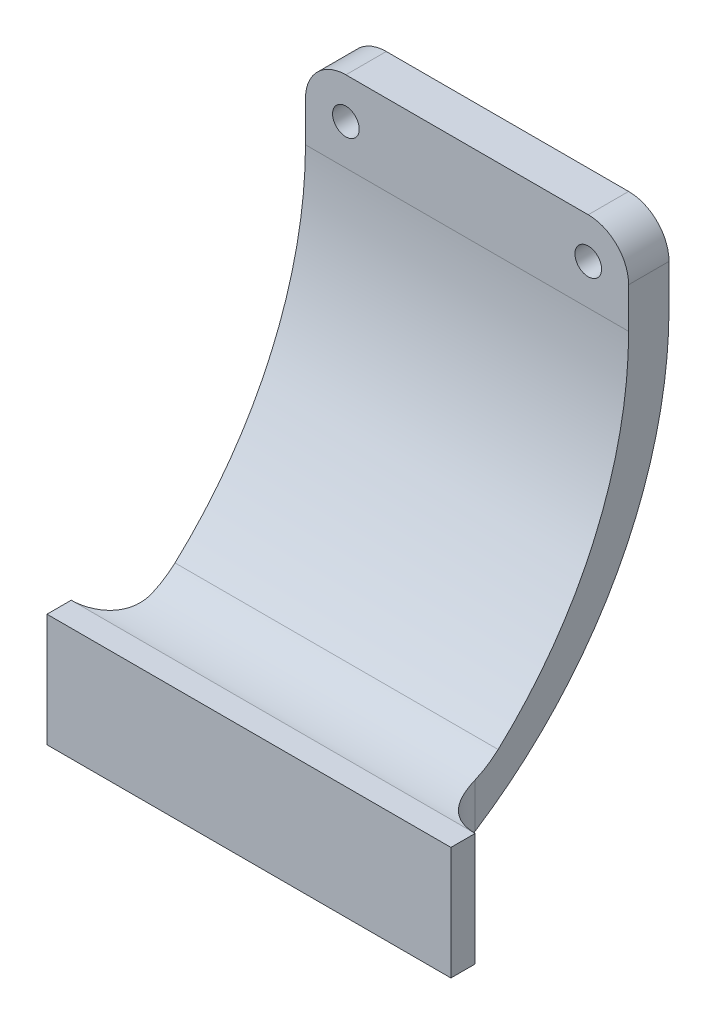
ISO-10303-21;
HEADER;
FILE_DESCRIPTION(('STEP AP214'),'2;1');
FILE_NAME('part.step','',(''),(''),'','','');
FILE_SCHEMA(('AUTOMOTIVE_DESIGN { 1 0 10303 214 1 1 1 1 }'));
ENDSEC;
DATA;
#1=APPLICATION_CONTEXT('core data for automotive mechanical design processes');
#2=APPLICATION_PROTOCOL_DEFINITION('international standard','automotive_design',2000,#1);
#3=PRODUCT_CONTEXT('',#1,'mechanical');
#4=PRODUCT('Part','Part','',(#3));
#5=PRODUCT_RELATED_PRODUCT_CATEGORY('part','',(#4));
#6=PRODUCT_DEFINITION_FORMATION('','',#4);
#7=PRODUCT_DEFINITION_CONTEXT('part definition',#1,'design');
#8=PRODUCT_DEFINITION('design','',#6,#7);
#9=PRODUCT_DEFINITION_SHAPE('','',#8);
#10=(LENGTH_UNIT() NAMED_UNIT(*) SI_UNIT(.MILLI.,.METRE.));
#11=(NAMED_UNIT(*) PLANE_ANGLE_UNIT() SI_UNIT($,.RADIAN.));
#12=(NAMED_UNIT(*) SI_UNIT($,.STERADIAN.) SOLID_ANGLE_UNIT());
#13=UNCERTAINTY_MEASURE_WITH_UNIT(LENGTH_MEASURE(1.E-05),#10,'distance_accuracy_value','');
#14=(GEOMETRIC_REPRESENTATION_CONTEXT(3) GLOBAL_UNCERTAINTY_ASSIGNED_CONTEXT((#13)) GLOBAL_UNIT_ASSIGNED_CONTEXT((#10,
#11,#12)) REPRESENTATION_CONTEXT('',''));
#15=CARTESIAN_POINT('',(0.,0.,0.));
#16=DIRECTION('',(0.,0.,1.));
#17=DIRECTION('',(1.,0.,0.));
#18=AXIS2_PLACEMENT_3D('',#15,#16,#17);
#19=CARTESIAN_POINT('',(-5.,5.,-5.));
#20=DIRECTION('',(1.,0.,0.));
#21=DIRECTION('',(0.,0.,1.));
#22=AXIS2_PLACEMENT_3D('',#19,#20,#21);
#23=PLANE('',#22);
#24=DIRECTION('',(0.,-1.,0.));
#25=VECTOR('',#24,1.);
#26=CARTESIAN_POINT('',(-5.,5.,-5.));
#27=LINE('',#26,#25);
#28=CARTESIAN_POINT('',(-5.,0.,-5.));
#29=VERTEX_POINT('',#28);
#30=CARTESIAN_POINT('',(-5.,-5.,-5.));
#31=VERTEX_POINT('',#30);
#32=EDGE_CURVE('E232',#29,#31,#27,.T.);
#33=ORIENTED_EDGE('',*,*,#32,.T.);
#34=CARTESIAN_POINT('',(-5.,-5.,47.4812709593483));
#35=DIRECTION('',(-1.,0.,0.));
#36=DIRECTION('',(0.,0.,1.));
#37=AXIS2_PLACEMENT_3D('',#34,#35,#36);
#38=CIRCLE('',#37,52.4812709593483);
#39=CARTESIAN_POINT('',(-5.,-49.0806193927526,19.));
#40=VERTEX_POINT('',#39);
#41=EDGE_CURVE('E211',#40,#31,#38,.F.);
#42=ORIENTED_EDGE('',*,*,#41,.F.);
#43=DIRECTION('',(0.,1.,0.));
#44=VECTOR('',#43,1.);
#45=CARTESIAN_POINT('',(-5.,-57.753328953178,19.));
#46=LINE('',#45,#44);
#47=CARTESIAN_POINT('',(-5.,-43.5810930202883,19.));
#48=VERTEX_POINT('',#47);
#49=EDGE_CURVE('E282',#48,#40,#46,.F.);
#50=ORIENTED_EDGE('',*,*,#49,.F.);
#51=CARTESIAN_POINT('',(-5.,-34.3789185712698,22.9140752943487));
#52=DIRECTION('',(-1.,0.,0.));
#53=DIRECTION('',(0.,0.,1.));
#54=AXIS2_PLACEMENT_3D('',#51,#52,#53);
#55=CIRCLE('',#54,10.);
#56=CARTESIAN_POINT('',(-5.,-41.7466961071543,16.1527252677848));
#57=VERTEX_POINT('',#56);
#58=EDGE_CURVE('E165',#57,#48,#55,.T.);
#59=ORIENTED_EDGE('',*,*,#58,.F.);
#60=CARTESIAN_POINT('',(-5.,-5.,49.8748719382214));
#61=DIRECTION('',(-1.,0.,0.));
#62=DIRECTION('',(0.,0.,1.));
#63=AXIS2_PLACEMENT_3D('',#60,#61,#62);
#64=CIRCLE('',#63,49.8748719382214);
#65=CARTESIAN_POINT('',(-5.,-5.,0.));
#66=VERTEX_POINT('',#65);
#67=EDGE_CURVE('E208',#66,#57,#64,.T.);
#68=ORIENTED_EDGE('',*,*,#67,.F.);
#69=DIRECTION('',(0.,-1.,0.));
#70=VECTOR('',#69,1.);
#71=CARTESIAN_POINT('',(-5.,5.,0.));
#72=LINE('',#71,#70);
#73=CARTESIAN_POINT('',(-5.,0.,0.));
#74=VERTEX_POINT('',#73);
#75=EDGE_CURVE('E229',#74,#66,#72,.T.);
#76=ORIENTED_EDGE('',*,*,#75,.F.);
#77=DIRECTION('',(0.,0.,1.));
#78=VECTOR('',#77,1.);
#79=CARTESIAN_POINT('',(-5.,0.,-5.));
#80=LINE('',#79,#78);
#81=EDGE_CURVE('E284',#29,#74,#80,.T.);
#82=ORIENTED_EDGE('',*,*,#81,.F.);
#83=EDGE_LOOP('',(#33,#42,#50,#59,#68,#76,#82));
#84=FACE_BOUND('',#83,.T.);
#85=ADVANCED_FACE('F43',(#84),#23,.F.);
#86=CARTESIAN_POINT('',(35.,5.,-5.));
#87=DIRECTION('',(-1.,0.,0.));
#88=DIRECTION('',(0.,0.,-1.));
#89=AXIS2_PLACEMENT_3D('',#86,#87,#88);
#90=PLANE('',#89);
#91=DIRECTION('',(0.,1.,0.));
#92=VECTOR('',#91,1.);
#93=CARTESIAN_POINT('',(35.,5.,0.));
#94=LINE('',#93,#92);
#95=CARTESIAN_POINT('',(35.,-5.,0.));
#96=VERTEX_POINT('',#95);
#97=CARTESIAN_POINT('',(35.,0.,0.));
#98=VERTEX_POINT('',#97);
#99=EDGE_CURVE('E249',#96,#98,#94,.T.);
#100=ORIENTED_EDGE('',*,*,#99,.F.);
#101=CARTESIAN_POINT('',(35.,-5.,49.8748719382214));
#102=DIRECTION('',(1.,0.,0.));
#103=DIRECTION('',(0.,0.,1.));
#104=AXIS2_PLACEMENT_3D('',#101,#102,#103);
#105=CIRCLE('',#104,49.8748719382214);
#106=CARTESIAN_POINT('',(35.,-41.7466961071543,16.1527252677848));
#107=VERTEX_POINT('',#106);
#108=EDGE_CURVE('E212',#107,#96,#105,.T.);
#109=ORIENTED_EDGE('',*,*,#108,.F.);
#110=CARTESIAN_POINT('',(35.,-34.3789185712698,22.9140752943487));
#111=DIRECTION('',(1.,0.,0.));
#112=DIRECTION('',(0.,0.,-1.));
#113=AXIS2_PLACEMENT_3D('',#110,#111,#112);
#114=CIRCLE('',#113,10.);
#115=CARTESIAN_POINT('',(35.,-43.5810930202883,19.));
#116=VERTEX_POINT('',#115);
#117=EDGE_CURVE('E260',#116,#107,#114,.T.);
#118=ORIENTED_EDGE('',*,*,#117,.F.);
#119=DIRECTION('',(0.,-1.,0.));
#120=VECTOR('',#119,1.);
#121=CARTESIAN_POINT('',(35.,-44.3197820917923,19.));
#122=LINE('',#121,#120);
#123=CARTESIAN_POINT('',(35.,-49.0806193927526,19.));
#124=VERTEX_POINT('',#123);
#125=EDGE_CURVE('E271',#124,#116,#122,.F.);
#126=ORIENTED_EDGE('',*,*,#125,.F.);
#127=CARTESIAN_POINT('',(35.,-5.,47.4812709593483));
#128=DIRECTION('',(-1.,0.,0.));
#129=DIRECTION('',(0.,0.,1.));
#130=AXIS2_PLACEMENT_3D('',#127,#128,#129);
#131=CIRCLE('',#130,52.4812709593483);
#132=CARTESIAN_POINT('',(35.,-5.,-5.));
#133=VERTEX_POINT('',#132);
#134=EDGE_CURVE('E205',#133,#124,#131,.T.);
#135=ORIENTED_EDGE('',*,*,#134,.F.);
#136=DIRECTION('',(0.,1.,0.));
#137=VECTOR('',#136,1.);
#138=CARTESIAN_POINT('',(35.,5.,-5.));
#139=LINE('',#138,#137);
#140=CARTESIAN_POINT('',(35.,0.,-5.));
#141=VERTEX_POINT('',#140);
#142=EDGE_CURVE('E238',#133,#141,#139,.T.);
#143=ORIENTED_EDGE('',*,*,#142,.T.);
#144=DIRECTION('',(0.,0.,1.));
#145=VECTOR('',#144,1.);
#146=CARTESIAN_POINT('',(35.,0.,-5.));
#147=LINE('',#146,#145);
#148=EDGE_CURVE('E274',#98,#141,#147,.F.);
#149=ORIENTED_EDGE('',*,*,#148,.F.);
#150=EDGE_LOOP('',(#100,#109,#118,#126,#135,#143,#149));
#151=FACE_BOUND('',#150,.T.);
#152=ADVANCED_FACE('F327',(#151),#90,.F.);
#153=CARTESIAN_POINT('',(-62.9551666497327,-5.,47.4812709593483));
#154=DIRECTION('',(1.,0.,0.));
#155=DIRECTION('',(0.,0.,1.));
#156=AXIS2_PLACEMENT_3D('',#153,#154,#155);
#157=CYLINDRICAL_SURFACE('',#156,52.4812709593483);
#158=ORIENTED_EDGE('',*,*,#41,.T.);
#159=DIRECTION('',(1.,0.,0.));
#160=VECTOR('',#159,1.);
#161=CARTESIAN_POINT('',(-5.,-5.,-5.));
#162=LINE('',#161,#160);
#163=EDGE_CURVE('E235',#31,#133,#162,.T.);
#164=ORIENTED_EDGE('',*,*,#163,.T.);
#165=ORIENTED_EDGE('',*,*,#134,.T.);
#166=CARTESIAN_POINT('',(35.0128766322397,-49.310266233231,19.3586091392302));
#167=CARTESIAN_POINT('',(35.0085787431682,-49.2722693323532,19.2987404613218));
#168=CARTESIAN_POINT('',(35.0053567459458,-49.2341336452079,19.2389220274318));
#169=CARTESIAN_POINT('',(35.0010645351992,-49.1575846983818,19.1193856476884));
#170=CARTESIAN_POINT('',(34.9999943216751,-49.119171438701,19.059667701835));
#171=CARTESIAN_POINT('',(35.,-49.0806193927526,19.));
#172=B_SPLINE_CURVE_WITH_KNOTS('',3,(#166,#167,#168,#169,#170,#171),.UNSPECIFIED.,.F.,.F.,(4,2,
4),(0.,0.213041339647605,0.426082679295853),.UNSPECIFIED.);
#173=CARTESIAN_POINT('',(35.0128766322397,-49.310266233231,19.3586091392302));
#174=VERTEX_POINT('',#173);
#175=EDGE_CURVE('E293',#174,#124,#172,.T.);
#176=ORIENTED_EDGE('',*,*,#175,.F.);
#177=DIRECTION('',(1.,0.,0.));
#178=VECTOR('',#177,1.);
#179=CARTESIAN_POINT('',(-62.9551666497327,-49.310266233231,19.3586091392302));
#180=LINE('',#179,#178);
#181=CARTESIAN_POINT('',(-5.01287663223972,-49.310266233231,19.3586091392302));
#182=VERTEX_POINT('',#181);
#183=EDGE_CURVE('E257',#182,#174,#180,.T.);
#184=ORIENTED_EDGE('',*,*,#183,.F.);
#185=CARTESIAN_POINT('',(-5.,-49.0806193927526,19.));
#186=CARTESIAN_POINT('',(-4.99999432167506,-49.119171438701,19.059667701835));
#187=CARTESIAN_POINT('',(-5.00106453519925,-49.1575846983817,19.1193856476884));
#188=CARTESIAN_POINT('',(-5.00535674594583,-49.2341336452079,19.2389220274318));
#189=CARTESIAN_POINT('',(-5.00857874316822,-49.2722693323532,19.2987404613218));
#190=CARTESIAN_POINT('',(-5.01287663223973,-49.310266233231,19.3586091392302));
#191=B_SPLINE_CURVE_WITH_KNOTS('',3,(#185,#186,#187,#188,#189,#190),.UNSPECIFIED.,.F.,.F.,(4,2,
4),(0.,0.213041339648248,0.426082679295861),.UNSPECIFIED.);
#192=EDGE_CURVE('E58',#40,#182,#191,.T.);
#193=ORIENTED_EDGE('',*,*,#192,.F.);
#194=EDGE_LOOP('',(#158,#164,#165,#176,#184,#193));
#195=FACE_BOUND('',#194,.T.);
#196=ADVANCED_FACE('F331',(#195),#157,.T.);
#197=CARTESIAN_POINT('',(-62.9551666497327,-5.,49.8748719382214));
#198=DIRECTION('',(1.,0.,0.));
#199=DIRECTION('',(0.,0.,1.));
#200=AXIS2_PLACEMENT_3D('',#197,#198,#199);
#201=CYLINDRICAL_SURFACE('',#200,49.8748719382214);
#202=ORIENTED_EDGE('',*,*,#108,.T.);
#203=DIRECTION('',(1.,0.,0.));
#204=VECTOR('',#203,1.);
#205=CARTESIAN_POINT('',(-5.,-5.,0.));
#206=LINE('',#205,#204);
#207=EDGE_CURVE('E247',#66,#96,#206,.T.);
#208=ORIENTED_EDGE('',*,*,#207,.F.);
#209=ORIENTED_EDGE('',*,*,#67,.T.);
#210=DIRECTION('',(1.,0.,0.));
#211=VECTOR('',#210,1.);
#212=CARTESIAN_POINT('',(-62.9551666497327,-41.7466961071543,16.1527252677848));
#213=LINE('',#212,#211);
#214=EDGE_CURVE('E244',#107,#57,#213,.F.);
#215=ORIENTED_EDGE('',*,*,#214,.F.);
#216=EDGE_LOOP('',(#202,#208,#209,#215));
#217=FACE_BOUND('',#216,.T.);
#218=ADVANCED_FACE('F345',(#217),#201,.F.);
#219=CARTESIAN_POINT('',(0.,0.,-5.));
#220=DIRECTION('',(0.,0.,-1.));
#221=DIRECTION('',(1.,0.,0.));
#222=AXIS2_PLACEMENT_3D('',#219,#220,#221);
#223=PLANE('',#222);
#224=CARTESIAN_POINT('',(0.,0.,-5.));
#225=DIRECTION('',(0.,0.,1.));
#226=DIRECTION('',(1.,0.,0.));
#227=AXIS2_PLACEMENT_3D('',#224,#225,#226);
#228=CIRCLE('',#227,1.65);
#229=CARTESIAN_POINT('',(1.65,0.,-5.));
#230=VERTEX_POINT('',#229);
#231=EDGE_CURVE('E226',#230,#230,#228,.T.);
#232=ORIENTED_EDGE('',*,*,#231,.T.);
#233=EDGE_LOOP('',(#232));
#234=FACE_BOUND('',#233,.T.);
#235=ORIENTED_EDGE('',*,*,#142,.F.);
#236=ORIENTED_EDGE('',*,*,#163,.F.);
#237=ORIENTED_EDGE('',*,*,#32,.F.);
#238=CARTESIAN_POINT('',(0.,0.,-5.));
#239=DIRECTION('',(0.,0.,1.));
#240=DIRECTION('',(1.,0.,0.));
#241=AXIS2_PLACEMENT_3D('',#238,#239,#240);
#242=CIRCLE('',#241,5.);
#243=CARTESIAN_POINT('',(0.,5.,-5.));
#244=VERTEX_POINT('',#243);
#245=EDGE_CURVE('E277',#244,#29,#242,.T.);
#246=ORIENTED_EDGE('',*,*,#245,.F.);
#247=DIRECTION('',(-1.,0.,0.));
#248=VECTOR('',#247,1.);
#249=CARTESIAN_POINT('',(-5.,5.,-5.));
#250=LINE('',#249,#248);
#251=CARTESIAN_POINT('',(30.,5.,-5.));
#252=VERTEX_POINT('',#251);
#253=EDGE_CURVE('E241',#252,#244,#250,.T.);
#254=ORIENTED_EDGE('',*,*,#253,.F.);
#255=CARTESIAN_POINT('',(30.,0.,-5.));
#256=DIRECTION('',(0.,0.,1.));
#257=DIRECTION('',(1.,0.,0.));
#258=AXIS2_PLACEMENT_3D('',#255,#256,#257);
#259=CIRCLE('',#258,5.);
#260=EDGE_CURVE('E279',#141,#252,#259,.T.);
#261=ORIENTED_EDGE('',*,*,#260,.F.);
#262=EDGE_LOOP('',(#235,#236,#237,#246,#254,#261));
#263=FACE_BOUND('',#262,.T.);
#264=CARTESIAN_POINT('',(30.,0.,-5.));
#265=DIRECTION('',(0.,0.,1.));
#266=DIRECTION('',(1.,0.,0.));
#267=AXIS2_PLACEMENT_3D('',#264,#265,#266);
#268=CIRCLE('',#267,1.65);
#269=CARTESIAN_POINT('',(31.65,0.,-5.));
#270=VERTEX_POINT('',#269);
#271=EDGE_CURVE('E220',#270,#270,#268,.T.);
#272=ORIENTED_EDGE('',*,*,#271,.T.);
#273=EDGE_LOOP('',(#272));
#274=FACE_BOUND('',#273,.T.);
#275=ADVANCED_FACE('F341',(#234,#263,#274),#223,.T.);
#276=CARTESIAN_POINT('',(0.,0.,0.));
#277=DIRECTION('',(0.,0.,-1.));
#278=DIRECTION('',(1.,0.,0.));
#279=AXIS2_PLACEMENT_3D('',#276,#277,#278);
#280=PLANE('',#279);
#281=DIRECTION('',(-1.,0.,0.));
#282=VECTOR('',#281,1.);
#283=CARTESIAN_POINT('',(-5.,5.,0.));
#284=LINE('',#283,#282);
#285=CARTESIAN_POINT('',(30.,5.,0.));
#286=VERTEX_POINT('',#285);
#287=CARTESIAN_POINT('',(0.,5.,0.));
#288=VERTEX_POINT('',#287);
#289=EDGE_CURVE('E236',#286,#288,#284,.T.);
#290=ORIENTED_EDGE('',*,*,#289,.T.);
#291=CARTESIAN_POINT('',(0.,0.,0.));
#292=DIRECTION('',(0.,0.,1.));
#293=DIRECTION('',(1.,0.,0.));
#294=AXIS2_PLACEMENT_3D('',#291,#292,#293);
#295=CIRCLE('',#294,5.);
#296=EDGE_CURVE('E266',#74,#288,#295,.F.);
#297=ORIENTED_EDGE('',*,*,#296,.F.);
#298=ORIENTED_EDGE('',*,*,#75,.T.);
#299=ORIENTED_EDGE('',*,*,#207,.T.);
#300=ORIENTED_EDGE('',*,*,#99,.T.);
#301=CARTESIAN_POINT('',(30.,0.,0.));
#302=DIRECTION('',(0.,0.,1.));
#303=DIRECTION('',(1.,0.,0.));
#304=AXIS2_PLACEMENT_3D('',#301,#302,#303);
#305=CIRCLE('',#304,5.);
#306=EDGE_CURVE('E269',#286,#98,#305,.F.);
#307=ORIENTED_EDGE('',*,*,#306,.F.);
#308=EDGE_LOOP('',(#290,#297,#298,#299,#300,#307));
#309=FACE_BOUND('',#308,.T.);
#310=CARTESIAN_POINT('',(0.,0.,0.));
#311=DIRECTION('',(0.,0.,1.));
#312=DIRECTION('',(1.,0.,0.));
#313=AXIS2_PLACEMENT_3D('',#310,#311,#312);
#314=CIRCLE('',#313,1.65);
#315=CARTESIAN_POINT('',(1.65,0.,0.));
#316=VERTEX_POINT('',#315);
#317=EDGE_CURVE('E223',#316,#316,#314,.T.);
#318=ORIENTED_EDGE('',*,*,#317,.F.);
#319=EDGE_LOOP('',(#318));
#320=FACE_BOUND('',#319,.T.);
#321=CARTESIAN_POINT('',(30.,0.,0.));
#322=DIRECTION('',(0.,0.,1.));
#323=DIRECTION('',(1.,0.,0.));
#324=AXIS2_PLACEMENT_3D('',#321,#322,#323);
#325=CIRCLE('',#324,1.65);
#326=CARTESIAN_POINT('',(31.65,0.,0.));
#327=VERTEX_POINT('',#326);
#328=EDGE_CURVE('E215',#327,#327,#325,.T.);
#329=ORIENTED_EDGE('',*,*,#328,.F.);
#330=EDGE_LOOP('',(#329));
#331=FACE_BOUND('',#330,.T.);
#332=ADVANCED_FACE('F337',(#309,#320,#331),#280,.F.);
#333=CARTESIAN_POINT('',(-5.,5.,-5.));
#334=DIRECTION('',(0.,-1.,0.));
#335=DIRECTION('',(0.,0.,1.));
#336=AXIS2_PLACEMENT_3D('',#333,#334,#335);
#337=PLANE('',#336);
#338=ORIENTED_EDGE('',*,*,#253,.T.);
#339=DIRECTION('',(0.,0.,1.));
#340=VECTOR('',#339,1.);
#341=CARTESIAN_POINT('',(0.,5.,-5.));
#342=LINE('',#341,#340);
#343=EDGE_CURVE('E262',#288,#244,#342,.F.);
#344=ORIENTED_EDGE('',*,*,#343,.F.);
#345=ORIENTED_EDGE('',*,*,#289,.F.);
#346=DIRECTION('',(0.,0.,1.));
#347=VECTOR('',#346,1.);
#348=CARTESIAN_POINT('',(30.,5.,-5.));
#349=LINE('',#348,#347);
#350=EDGE_CURVE('E264',#252,#286,#349,.T.);
#351=ORIENTED_EDGE('',*,*,#350,.F.);
#352=EDGE_LOOP('',(#338,#344,#345,#351));
#353=FACE_BOUND('',#352,.T.);
#354=ADVANCED_FACE('F333',(#353),#337,.F.);
#355=CARTESIAN_POINT('',(0.,0.,-5.));
#356=DIRECTION('',(0.,0.,1.));
#357=DIRECTION('',(-1.,0.,0.));
#358=AXIS2_PLACEMENT_3D('',#355,#356,#357);
#359=CYLINDRICAL_SURFACE('',#358,1.65);
#360=ORIENTED_EDGE('',*,*,#231,.F.);
#361=EDGE_LOOP('',(#360));
#362=FACE_BOUND('',#361,.T.);
#363=ORIENTED_EDGE('',*,*,#317,.T.);
#364=EDGE_LOOP('',(#363));
#365=FACE_BOUND('',#364,.T.);
#366=ADVANCED_FACE('F336',(#362,#365),#359,.F.);
#367=CARTESIAN_POINT('',(30.,0.,-5.));
#368=DIRECTION('',(0.,0.,1.));
#369=DIRECTION('',(-1.,0.,0.));
#370=AXIS2_PLACEMENT_3D('',#367,#368,#369);
#371=CYLINDRICAL_SURFACE('',#370,1.65);
#372=ORIENTED_EDGE('',*,*,#271,.F.);
#373=EDGE_LOOP('',(#372));
#374=FACE_BOUND('',#373,.T.);
#375=ORIENTED_EDGE('',*,*,#328,.T.);
#376=EDGE_LOOP('',(#375));
#377=FACE_BOUND('',#376,.T.);
#378=ADVANCED_FACE('F349',(#374,#377),#371,.F.);
#379=CARTESIAN_POINT('',(40.,-58.3197820917923,24.));
#380=DIRECTION('',(0.,-1.,0.));
#381=DIRECTION('',(0.,0.,1.));
#382=AXIS2_PLACEMENT_3D('',#379,#380,#381);
#383=PLANE('',#382);
#384=DIRECTION('',(-1.,0.,0.));
#385=VECTOR('',#384,1.);
#386=CARTESIAN_POINT('',(40.,-58.3197820917923,27.));
#387=LINE('',#386,#385);
#388=CARTESIAN_POINT('',(40.,-58.3197820917923,27.));
#389=VERTEX_POINT('',#388);
#390=CARTESIAN_POINT('',(-10.,-58.3197820917923,27.));
#391=VERTEX_POINT('',#390);
#392=EDGE_CURVE('E194',#389,#391,#387,.T.);
#393=ORIENTED_EDGE('',*,*,#392,.T.);
#394=DIRECTION('',(0.,0.,1.));
#395=VECTOR('',#394,1.);
#396=CARTESIAN_POINT('',(-10.,-58.3197820917923,24.));
#397=LINE('',#396,#395);
#398=CARTESIAN_POINT('',(-10.,-58.3197820917923,24.));
#399=VERTEX_POINT('',#398);
#400=EDGE_CURVE('E182',#399,#391,#397,.T.);
#401=ORIENTED_EDGE('',*,*,#400,.F.);
#402=DIRECTION('',(-1.,0.,0.));
#403=VECTOR('',#402,1.);
#404=CARTESIAN_POINT('',(40.,-58.3197820917923,24.));
#405=LINE('',#404,#403);
#406=CARTESIAN_POINT('',(40.,-58.3197820917923,24.));
#407=VERTEX_POINT('',#406);
#408=EDGE_CURVE('E173',#407,#399,#405,.T.);
#409=ORIENTED_EDGE('',*,*,#408,.F.);
#410=DIRECTION('',(0.,0.,1.));
#411=VECTOR('',#410,1.);
#412=CARTESIAN_POINT('',(40.,-58.3197820917923,24.));
#413=LINE('',#412,#411);
#414=EDGE_CURVE('E202',#407,#389,#413,.T.);
#415=ORIENTED_EDGE('',*,*,#414,.T.);
#416=EDGE_LOOP('',(#393,#401,#409,#415));
#417=FACE_BOUND('',#416,.T.);
#418=ADVANCED_FACE('F352',(#417),#383,.T.);
#419=CARTESIAN_POINT('',(40.,-44.3197820917923,24.));
#420=DIRECTION('',(1.,0.,0.));
#421=DIRECTION('',(0.,0.,1.));
#422=AXIS2_PLACEMENT_3D('',#419,#420,#421);
#423=PLANE('',#422);
#424=DIRECTION('',(0.,-1.,0.));
#425=VECTOR('',#424,1.);
#426=CARTESIAN_POINT('',(40.,-44.3197820917923,27.));
#427=LINE('',#426,#425);
#428=CARTESIAN_POINT('',(40.,-44.3197820917923,27.));
#429=VERTEX_POINT('',#428);
#430=EDGE_CURVE('E200',#429,#389,#427,.T.);
#431=ORIENTED_EDGE('',*,*,#430,.T.);
#432=ORIENTED_EDGE('',*,*,#414,.F.);
#433=DIRECTION('',(0.,-1.,0.));
#434=VECTOR('',#433,1.);
#435=CARTESIAN_POINT('',(40.,-44.3197820917923,24.));
#436=LINE('',#435,#434);
#437=CARTESIAN_POINT('',(40.,-57.753328953178,24.));
#438=VERTEX_POINT('',#437);
#439=EDGE_CURVE('E187',#438,#407,#436,.T.);
#440=ORIENTED_EDGE('',*,*,#439,.F.);
#441=CARTESIAN_POINT('',(40.,-44.3197820917923,24.));
#442=VERTEX_POINT('',#441);
#443=EDGE_CURVE('E189',#442,#438,#436,.T.);
#444=ORIENTED_EDGE('',*,*,#443,.F.);
#445=DIRECTION('',(0.,0.,1.));
#446=VECTOR('',#445,1.);
#447=CARTESIAN_POINT('',(40.,-44.3197820917923,24.));
#448=LINE('',#447,#446);
#449=EDGE_CURVE('E181',#442,#429,#448,.T.);
#450=ORIENTED_EDGE('',*,*,#449,.T.);
#451=EDGE_LOOP('',(#431,#432,#440,#444,#450));
#452=FACE_BOUND('',#451,.T.);
#453=ADVANCED_FACE('F373',(#452),#423,.T.);
#454=CARTESIAN_POINT('',(-10.,-44.3197820917923,24.));
#455=DIRECTION('',(0.,1.,0.));
#456=DIRECTION('',(0.,0.,-1.));
#457=AXIS2_PLACEMENT_3D('',#454,#455,#456);
#458=PLANE('',#457);
#459=DIRECTION('',(1.,0.,0.));
#460=VECTOR('',#459,1.);
#461=CARTESIAN_POINT('',(-10.,-44.3197820917923,27.));
#462=LINE('',#461,#460);
#463=CARTESIAN_POINT('',(-10.,-44.3197820917923,27.));
#464=VERTEX_POINT('',#463);
#465=EDGE_CURVE('E198',#464,#429,#462,.T.);
#466=ORIENTED_EDGE('',*,*,#465,.T.);
#467=ORIENTED_EDGE('',*,*,#449,.F.);
#468=DIRECTION('',(1.,0.,0.));
#469=VECTOR('',#468,1.);
#470=CARTESIAN_POINT('',(-10.,-44.3197820917923,24.));
#471=LINE('',#470,#469);
#472=CARTESIAN_POINT('',(-10.,-44.3197820917923,24.));
#473=VERTEX_POINT('',#472);
#474=EDGE_CURVE('E162',#473,#442,#471,.T.);
#475=ORIENTED_EDGE('',*,*,#474,.F.);
#476=DIRECTION('',(0.,0.,1.));
#477=VECTOR('',#476,1.);
#478=CARTESIAN_POINT('',(-10.,-44.3197820917923,24.));
#479=LINE('',#478,#477);
#480=EDGE_CURVE('E176',#473,#464,#479,.T.);
#481=ORIENTED_EDGE('',*,*,#480,.T.);
#482=EDGE_LOOP('',(#466,#467,#475,#481));
#483=FACE_BOUND('',#482,.T.);
#484=ADVANCED_FACE('F184',(#483),#458,.T.);
#485=CARTESIAN_POINT('',(-10.,-58.3197820917923,24.));
#486=DIRECTION('',(-1.,0.,0.));
#487=DIRECTION('',(0.,0.,-1.));
#488=AXIS2_PLACEMENT_3D('',#485,#486,#487);
#489=PLANE('',#488);
#490=DIRECTION('',(0.,1.,0.));
#491=VECTOR('',#490,1.);
#492=CARTESIAN_POINT('',(-10.,-58.3197820917923,27.));
#493=LINE('',#492,#491);
#494=EDGE_CURVE('E178',#391,#464,#493,.T.);
#495=ORIENTED_EDGE('',*,*,#494,.T.);
#496=ORIENTED_EDGE('',*,*,#480,.F.);
#497=DIRECTION('',(0.,1.,0.));
#498=VECTOR('',#497,1.);
#499=CARTESIAN_POINT('',(-10.,-58.3197820917923,24.));
#500=LINE('',#499,#498);
#501=CARTESIAN_POINT('',(-10.,-57.753328953178,24.));
#502=VERTEX_POINT('',#501);
#503=EDGE_CURVE('E171',#502,#473,#500,.T.);
#504=ORIENTED_EDGE('',*,*,#503,.F.);
#505=EDGE_CURVE('E151',#399,#502,#500,.T.);
#506=ORIENTED_EDGE('',*,*,#505,.F.);
#507=ORIENTED_EDGE('',*,*,#400,.T.);
#508=EDGE_LOOP('',(#495,#496,#504,#506,#507));
#509=FACE_BOUND('',#508,.T.);
#510=ADVANCED_FACE('F177',(#509),#489,.T.);
#511=CARTESIAN_POINT('',(0.,0.,24.0000000000001));
#512=DIRECTION('',(0.,0.,1.));
#513=DIRECTION('',(0.,1.,0.));
#514=AXIS2_PLACEMENT_3D('',#511,#512,#513);
#515=PLANE('',#514);
#516=ORIENTED_EDGE('',*,*,#439,.T.);
#517=ORIENTED_EDGE('',*,*,#408,.T.);
#518=ORIENTED_EDGE('',*,*,#505,.T.);
#519=DIRECTION('',(1.,0.,0.));
#520=VECTOR('',#519,1.);
#521=CARTESIAN_POINT('',(0.,-57.753328953178,24.));
#522=LINE('',#521,#520);
#523=EDGE_CURVE('E255',#438,#502,#522,.F.);
#524=ORIENTED_EDGE('',*,*,#523,.F.);
#525=EDGE_LOOP('',(#516,#517,#518,#524));
#526=FACE_BOUND('',#525,.T.);
#527=ADVANCED_FACE('F369',(#526),#515,.F.);
#528=CARTESIAN_POINT('',(-62.9551666497327,-53.3197820917923,27.));
#529=DIRECTION('',(0.,0.,1.));
#530=DIRECTION('',(0.,1.,0.));
#531=AXIS2_PLACEMENT_3D('',#528,#529,#530);
#532=PLANE('',#531);
#533=ORIENTED_EDGE('',*,*,#392,.F.);
#534=ORIENTED_EDGE('',*,*,#430,.F.);
#535=ORIENTED_EDGE('',*,*,#465,.F.);
#536=ORIENTED_EDGE('',*,*,#494,.F.);
#537=EDGE_LOOP('',(#533,#534,#535,#536));
#538=FACE_BOUND('',#537,.T.);
#539=ADVANCED_FACE('F323',(#538),#532,.T.);
#540=CARTESIAN_POINT('',(0.,-34.3789185712698,22.9140752943487));
#541=DIRECTION('',(-1.,0.,0.));
#542=DIRECTION('',(0.,0.,-1.));
#543=AXIS2_PLACEMENT_3D('',#540,#541,#542);
#544=CYLINDRICAL_SURFACE('',#543,10.);
#545=ORIENTED_EDGE('',*,*,#117,.T.);
#546=ORIENTED_EDGE('',*,*,#214,.T.);
#547=ORIENTED_EDGE('',*,*,#58,.T.);
#548=CARTESIAN_POINT('',(-10.,-44.3197820917923,24.));
#549=CARTESIAN_POINT('',(-9.85949516997654,-44.3197578066201,24.0000155613798));
#550=CARTESIAN_POINT('',(-9.71899422791782,-44.3204282933302,23.994078190787));
#551=CARTESIAN_POINT('',(-9.43901341737671,-44.3229829304871,23.9704112032078));
#552=CARTESIAN_POINT('',(-9.29953345018374,-44.3248669619947,23.952682741856));
#553=CARTESIAN_POINT('',(-9.02270989550712,-44.3296706180774,23.9055692636809));
#554=CARTESIAN_POINT('',(-8.88536442618997,-44.3325892692595,23.8761952002331));
#555=CARTESIAN_POINT('',(-8.61364593148569,-44.3391247046282,23.8060075867875));
#556=CARTESIAN_POINT('',(-8.47927290892156,-44.3427414894779,23.765194025926));
#557=CARTESIAN_POINT('',(-8.21442214407424,-44.3502320561554,23.6724088263925));
#558=CARTESIAN_POINT('',(-8.08394496240082,-44.3541058747143,23.6204355905786));
#559=CARTESIAN_POINT('',(-7.82777129771934,-44.3615691749095,23.5056772765997));
#560=CARTESIAN_POINT('',(-7.70207650563334,-44.3651585564534,23.4428884169099));
#561=CARTESIAN_POINT('',(-7.45640172591478,-44.371429600896,23.3069496939158));
#562=CARTESIAN_POINT('',(-7.33642150179509,-44.3741113013856,23.233800259864));
#563=CARTESIAN_POINT('',(-7.10302529325671,-44.3778854622254,23.0776525647018));
#564=CARTESIAN_POINT('',(-6.9896091459119,-44.3789779620373,22.9946545481979));
#565=CARTESIAN_POINT('',(-6.77020985336007,-44.3788542443268,22.8194443174801));
#566=CARTESIAN_POINT('',(-6.66422348824081,-44.3776390334124,22.7272361372992));
#567=CARTESIAN_POINT('',(-6.46045854122304,-44.3721703865065,22.5343065918845));
#568=CARTESIAN_POINT('',(-6.36267688229816,-44.3679180952594,22.4335884468571));
#569=CARTESIAN_POINT('',(-6.17606167020917,-44.3556610932894,22.2244576340981));
#570=CARTESIAN_POINT('',(-6.08722447102067,-44.3476579191211,22.11604813256));
#571=CARTESIAN_POINT('',(-5.91913870642343,-44.3272267030566,21.8924267445952));
#572=CARTESIAN_POINT('',(-5.83988960922972,-44.3147989067142,21.7772152359562));
#573=CARTESIAN_POINT('',(-5.69455122377568,-44.2855241771666,21.5457857300991));
#574=CARTESIAN_POINT('',(-5.6280609608957,-44.2688749930532,21.4297944104048));
#575=CARTESIAN_POINT('',(-5.50487274379135,-44.2305196823034,21.1935307257796));
#576=CARTESIAN_POINT('',(-5.44817424424338,-44.2088138374412,21.0732585997058));
#577=CARTESIAN_POINT('',(-5.34483415188708,-44.1600170939445,20.8294719329543));
#578=CARTESIAN_POINT('',(-5.29819661408121,-44.1329240324517,20.7059561073397));
#579=CARTESIAN_POINT('',(-5.21515195322959,-44.0731703973348,20.4568661443996));
#580=CARTESIAN_POINT('',(-5.17874326247458,-44.0405106781104,20.3312923256151));
#581=CARTESIAN_POINT('',(-5.12241987801574,-43.9767008942283,20.104531978947));
#582=CARTESIAN_POINT('',(-5.1006612122727,-43.9465645464092,20.0035116878863));
#583=CARTESIAN_POINT('',(-5.06357623274987,-43.8827387854094,19.8014190483291));
#584=CARTESIAN_POINT('',(-5.04824941088006,-43.8490496531475,19.7003467045765));
#585=CARTESIAN_POINT('',(-5.02391000448137,-43.7782460216528,19.4988118979896));
#586=CARTESIAN_POINT('',(-5.01488854018246,-43.7411364231881,19.3983487757942));
#587=CARTESIAN_POINT('',(-5.00293033329822,-43.6635833610599,19.198358821437));
#588=CARTESIAN_POINT('',(-4.99999310183399,-43.6231401655286,19.0988319146885));
#589=CARTESIAN_POINT('',(-5.,-43.5810930202883,19.));
#590=B_SPLINE_CURVE_WITH_KNOTS('',3,(#548,#549,#550,#551,#552,#553,#554,#555,#556,#557,#558,
#559,#560,#561,#562,#563,#564,#565,#566,#567,#568,#569,#570,#571,#572,#573,#574,#575,#576,#577,
#578,#579,#580,#581,#582,#583,#584,#585,#586,#587,#588,#589),.UNSPECIFIED.,.F.,.F.,(4,2,2,2,2,2,
2,2,2,2,2,2,2,2,2,2,2,2,2,2,4),(0.,0.421381689897785,0.842722086621604,1.2636671244718,
1.68461256208622,2.10561828445332,2.52677150521133,2.94790728212972,3.36903260160458,
3.78997427120712,4.21075736202527,4.63136822889957,5.05195575672567,5.45563442599842,
5.85929060631361,6.26310917481228,6.66686581884464,6.98954831332254,7.31220531237004,
7.63440699630971,7.95658278976862),.UNSPECIFIED.);
#591=EDGE_CURVE('E157',#473,#48,#590,.T.);
#592=ORIENTED_EDGE('',*,*,#591,.F.);
#593=ORIENTED_EDGE('',*,*,#474,.T.);
#594=CARTESIAN_POINT('',(35.,-43.5810930202883,19.));
#595=CARTESIAN_POINT('',(34.9999825275517,-43.6330790324058,19.1221662803937));
#596=CARTESIAN_POINT('',(35.0044773193817,-43.6826035517591,19.2454094337203));
#597=CARTESIAN_POINT('',(35.0228366757743,-43.7765252448043,19.4931931870946));
#598=CARTESIAN_POINT('',(35.0367046942624,-43.8209205213658,19.6177342487445));
#599=CARTESIAN_POINT('',(35.0741467410661,-43.9043194902782,19.8671026651939));
#600=CARTESIAN_POINT('',(35.0977158284854,-43.9433259137627,19.9919298421338));
#601=CARTESIAN_POINT('',(35.1547460086236,-44.0158734780296,20.2408934302758));
#602=CARTESIAN_POINT('',(35.1882055766699,-44.0494154599508,20.3650299449446));
#603=CARTESIAN_POINT('',(35.2651771534861,-44.1111440970404,20.6118978041216));
#604=CARTESIAN_POINT('',(35.3087160576296,-44.1393160495933,20.7346244501979));
#605=CARTESIAN_POINT('',(35.4056996945426,-44.1903420236422,20.9772383135201));
#606=CARTESIAN_POINT('',(35.4591445197496,-44.2131959955087,21.0971255042577));
#607=CARTESIAN_POINT('',(35.575655338131,-44.2538469221112,21.3329068229395));
#608=CARTESIAN_POINT('',(35.638714349442,-44.2716475199957,21.4488037743416));
#609=CARTESIAN_POINT('',(35.7741101472861,-44.3026027567858,21.675688090812));
#610=CARTESIAN_POINT('',(35.8464466842873,-44.3157575206118,21.786675587819));
#611=CARTESIAN_POINT('',(35.9979485834921,-44.3376210025705,22.0000439435671));
#612=CARTESIAN_POINT('',(36.0768908541517,-44.3464352286974,22.1025726353364));
#613=CARTESIAN_POINT('',(36.2426437373687,-44.3606280893209,22.3013676447818));
#614=CARTESIAN_POINT('',(36.329456996924,-44.3660055631144,22.3976318368841));
#615=CARTESIAN_POINT('',(36.5103755062363,-44.3738747570787,22.5831991607824));
#616=CARTESIAN_POINT('',(36.6044820096769,-44.3763659799339,22.6725010904735));
#617=CARTESIAN_POINT('',(36.7994005924977,-44.3790360813644,22.8435640554095));
#618=CARTESIAN_POINT('',(36.900215067539,-44.379214129317,22.9253223714051));
#619=CARTESIAN_POINT('',(37.1122389557393,-44.3778026414596,23.0840048554151));
#620=CARTESIAN_POINT('',(37.2237069027943,-44.3761387524557,23.1605830755435));
#621=CARTESIAN_POINT('',(37.4524604899842,-44.3715552952987,23.3044512640429));
#622=CARTESIAN_POINT('',(37.5697463225208,-44.3686356855936,23.3717409249557));
#623=CARTESIAN_POINT('',(37.8093815304723,-44.3621330362905,23.4966039376049));
#624=CARTESIAN_POINT('',(37.9317315577448,-44.358549911078,23.5541760336331));
#625=CARTESIAN_POINT('',(38.1806466266226,-44.3512579519396,23.6592053554522));
#626=CARTESIAN_POINT('',(38.3072102287242,-44.3475491609379,23.7066659954872));
#627=CARTESIAN_POINT('',(38.5613673996735,-44.3405346640355,23.790396726206));
#628=CARTESIAN_POINT('',(38.6888972602269,-44.3372227086704,23.8268597935922));
#629=CARTESIAN_POINT('',(38.9464647469899,-44.3312774779538,23.8895432015001));
#630=CARTESIAN_POINT('',(39.0765023372235,-44.3286441928739,23.9157636888479));
#631=CARTESIAN_POINT('',(39.3383515859833,-44.3243248797092,23.9578026329507));
#632=CARTESIAN_POINT('',(39.4701643510507,-44.3226394733945,23.9736142630715));
#633=CARTESIAN_POINT('',(39.7346503561982,-44.3203583548106,23.9947196175965));
#634=CARTESIAN_POINT('',(39.8673236743228,-44.3197627428028,24.0000123742635));
#635=CARTESIAN_POINT('',(40.,-44.3197820917923,24.));
#636=B_SPLINE_CURVE_WITH_KNOTS('',3,(#594,#595,#596,#597,#598,#599,#600,#601,#602,#603,#604,
#605,#606,#607,#608,#609,#610,#611,#612,#613,#614,#615,#616,#617,#618,#619,#620,#621,#622,#623,
#624,#625,#626,#627,#628,#629,#630,#631,#632,#633,#634,#635),.UNSPECIFIED.,.F.,.F.,(4,2,2,2,2,2,
2,2,2,2,2,2,2,2,2,2,2,2,2,2,4),(0.,0.398238923344071,0.796624673185759,1.19480776991869,
1.59292951649933,1.99212609919468,2.39132640719394,2.79023818302829,3.18913923182554,
3.57779559046404,3.96658314174373,4.35543767313654,4.74443183187996,5.14972023063652,
5.55502204152533,5.96037618566624,6.36559323983509,6.76321939391235,7.16083984786135,
7.55872082150267,7.95663839853115),.UNSPECIFIED.);
#637=EDGE_CURVE('E169',#116,#442,#636,.T.);
#638=ORIENTED_EDGE('',*,*,#637,.F.);
#639=EDGE_LOOP('',(#545,#546,#547,#592,#593,#638));
#640=FACE_BOUND('',#639,.T.);
#641=ADVANCED_FACE('F160',(#640),#544,.F.);
#642=CARTESIAN_POINT('',(-62.9551666497327,-57.753328953178,14.));
#643=DIRECTION('',(1.,0.,0.));
#644=DIRECTION('',(0.,0.,1.));
#645=AXIS2_PLACEMENT_3D('',#642,#643,#644);
#646=CYLINDRICAL_SURFACE('',#645,10.);
#647=ORIENTED_EDGE('',*,*,#183,.T.);
#648=CARTESIAN_POINT('',(35.0128766322397,-49.310266233231,19.3586091392302));
#649=CARTESIAN_POINT('',(35.0194006267308,-49.3678383988075,19.4493245570161));
#650=CARTESIAN_POINT('',(35.0283330782345,-49.4267823718731,19.5389606677923));
#651=CARTESIAN_POINT('',(35.0507109704186,-49.5472263031723,19.7158831516655));
#652=CARTESIAN_POINT('',(35.0641549784352,-49.6087254445763,19.8031702612047));
#653=CARTESIAN_POINT('',(35.1107311829831,-49.7965232849846,20.0608853313487));
#654=CARTESIAN_POINT('',(35.1501425157761,-49.9264060924545,20.2276129535296));
#655=CARTESIAN_POINT('',(35.2428336151493,-50.1926333956498,20.5481924804551));
#656=CARTESIAN_POINT('',(35.2959445818955,-50.3288837743876,20.7021729008215));
#657=CARTESIAN_POINT('',(35.414254710116,-50.6081328129672,20.9991245509268));
#658=CARTESIAN_POINT('',(35.4794622792239,-50.7511361145164,21.1420880250147));
#659=CARTESIAN_POINT('',(35.6386595939821,-51.0811234690673,21.4528976308378));
#660=CARTESIAN_POINT('',(35.7357085772375,-51.2697823143355,21.6173980530315));
#661=CARTESIAN_POINT('',(35.9431086623868,-51.6542510443569,21.9285840484464));
#662=CARTESIAN_POINT('',(36.0534610313488,-51.8500616090289,22.0752679220722));
#663=CARTESIAN_POINT('',(36.2856336614818,-52.2485757317883,22.3520589675448));
#664=CARTESIAN_POINT('',(36.4075171132514,-52.4513128584583,22.4820643615175));
#665=CARTESIAN_POINT('',(36.6600985883095,-52.8614111410629,22.7250188167738));
#666=CARTESIAN_POINT('',(36.7907971338259,-53.0687725704645,22.8379668662524));
#667=CARTESIAN_POINT('',(37.1111852654946,-53.5680831868318,23.0878467807253));
#668=CARTESIAN_POINT('',(37.3041514604906,-53.8617505316801,23.217176882225));
#669=CARTESIAN_POINT('',(37.6999948707343,-54.4542452430195,23.4454697186307));
#670=CARTESIAN_POINT('',(37.9028766280658,-54.753074932959,23.544418382489));
#671=CARTESIAN_POINT('',(38.3150154358756,-55.3535422257551,23.7127766474559));
#672=CARTESIAN_POINT('',(38.524257230706,-55.6551720639444,23.7822517478379));
#673=CARTESIAN_POINT('',(38.9469300347603,-56.2604650796835,23.8927214395848));
#674=CARTESIAN_POINT('',(39.1603586404824,-56.5641270283009,23.9337319063849));
#675=CARTESIAN_POINT('',(39.4767669558933,-57.0129229322114,23.9736096661266));
#676=CARTESIAN_POINT('',(39.5789932189671,-57.1577101815561,23.9832992960071));
#677=CARTESIAN_POINT('',(39.7836327400367,-57.4473354104957,23.9963677493405));
#678=CARTESIAN_POINT('',(39.8860458577017,-57.5921733137558,23.9997501778043));
#679=CARTESIAN_POINT('',(39.9923020088421,-57.7424423495166,23.9999955551791));
#680=CARTESIAN_POINT('',(39.9961510120575,-57.7478856620571,23.9999999995568));
#681=CARTESIAN_POINT('',(40.,-57.753328953178,24.));
#682=B_SPLINE_CURVE_WITH_KNOTS('',3,(#648,#649,#650,#651,#652,#653,#654,#655,#656,#657,#658,
#659,#660,#661,#662,#663,#664,#665,#666,#667,#668,#669,#670,#671,#672,#673,#674,#675,#676,#677,
#678,#679,#680,#681),.UNSPECIFIED.,.F.,.F.,(4,2,2,2,2,2,2,2,2,2,2,2,2,2,2,2,4),(0.,
0.322827597151928,0.645552775908431,1.28942180744448,1.92570777465594,2.56243765495872,
3.36664277902057,4.17092455943166,4.97990190281423,5.78892721416154,6.91062898313875,
8.03284948311803,9.15256283312657,10.2716511882126,10.8040774609993,11.3361993211957,
11.3561993256401),.UNSPECIFIED.);
#683=EDGE_CURVE('E287',#438,#174,#682,.F.);
#684=ORIENTED_EDGE('',*,*,#683,.F.);
#685=ORIENTED_EDGE('',*,*,#523,.T.);
#686=CARTESIAN_POINT('',(-5.01287663223973,-49.310266233231,19.3586091392302));
#687=CARTESIAN_POINT('',(-5.0194006267308,-49.3678383988075,19.4493245570161));
#688=CARTESIAN_POINT('',(-5.02833307823453,-49.4267823718731,19.5389606677923));
#689=CARTESIAN_POINT('',(-5.05071097041856,-49.5472263031723,19.7158831516655));
#690=CARTESIAN_POINT('',(-5.06415497843526,-49.6087254445763,19.8031702612047));
#691=CARTESIAN_POINT('',(-5.11073118298309,-49.7965232849846,20.0608853313487));
#692=CARTESIAN_POINT('',(-5.15014251577611,-49.9264060924545,20.2276129535296));
#693=CARTESIAN_POINT('',(-5.24283361514929,-50.1926333956498,20.5481924804551));
#694=CARTESIAN_POINT('',(-5.29594458189552,-50.3288837743876,20.7021729008215));
#695=CARTESIAN_POINT('',(-5.41425471011597,-50.6081328129672,20.9991245509268));
#696=CARTESIAN_POINT('',(-5.47946227922387,-50.7511361145164,21.1420880250147));
#697=CARTESIAN_POINT('',(-5.63865959398211,-51.0811234690673,21.4528976308378));
#698=CARTESIAN_POINT('',(-5.73570857723753,-51.2697823143355,21.6173980530315));
#699=CARTESIAN_POINT('',(-5.94310866238679,-51.6542510443569,21.9285840484464));
#700=CARTESIAN_POINT('',(-6.05346103134883,-51.8500616090289,22.0752679220722));
#701=CARTESIAN_POINT('',(-6.28563366148185,-52.2485757317883,22.3520589675448));
#702=CARTESIAN_POINT('',(-6.40751711325137,-52.4513128584583,22.4820643615175));
#703=CARTESIAN_POINT('',(-6.66009858830954,-52.8614111410629,22.7250188167738));
#704=CARTESIAN_POINT('',(-6.7907971338259,-53.0687725704645,22.8379668662524));
#705=CARTESIAN_POINT('',(-7.11118526549463,-53.5680831868318,23.0878467807253));
#706=CARTESIAN_POINT('',(-7.30415146049057,-53.8617505316801,23.217176882225));
#707=CARTESIAN_POINT('',(-7.69999487073427,-54.4542452430195,23.4454697186307));
#708=CARTESIAN_POINT('',(-7.90287662806576,-54.753074932959,23.544418382489));
#709=CARTESIAN_POINT('',(-8.31501543587558,-55.3535422257551,23.7127766474559));
#710=CARTESIAN_POINT('',(-8.52425723070598,-55.6551720639444,23.7822517478379));
#711=CARTESIAN_POINT('',(-8.94693003476028,-56.2604650796835,23.8927214395847));
#712=CARTESIAN_POINT('',(-9.16035864048245,-56.5641270283009,23.9337319063849));
#713=CARTESIAN_POINT('',(-9.47676695589329,-57.0129229322114,23.9736096661266));
#714=CARTESIAN_POINT('',(-9.57899321896712,-57.1577101815561,23.9832992960071));
#715=CARTESIAN_POINT('',(-9.78363274003666,-57.4473354104957,23.9963677493405));
#716=CARTESIAN_POINT('',(-9.88604585770168,-57.5921733137558,23.9997501778043));
#717=CARTESIAN_POINT('',(-9.99230200884207,-57.7424423495166,23.9999955551791));
#718=CARTESIAN_POINT('',(-9.99615101205749,-57.7478856620571,23.9999999995568));
#719=CARTESIAN_POINT('',(-10.,-57.753328953178,24.));
#720=B_SPLINE_CURVE_WITH_KNOTS('',3,(#686,#687,#688,#689,#690,#691,#692,#693,#694,#695,#696,
#697,#698,#699,#700,#701,#702,#703,#704,#705,#706,#707,#708,#709,#710,#711,#712,#713,#714,#715,
#716,#717,#718,#719),.UNSPECIFIED.,.F.,.F.,(4,2,2,2,2,2,2,2,2,2,2,2,2,2,2,2,4),(0.,
0.322827597151929,0.645552775908435,1.28942180744449,1.92570777465595,2.56243765495872,
3.36664277902057,4.17092455943166,4.97990190281424,5.78892721416154,6.91062898313874,
8.03284948311802,9.15256283312656,10.2716511882126,10.8040774609993,11.3361993211957,
11.3561993256401),.UNSPECIFIED.);
#721=EDGE_CURVE('E11',#182,#502,#720,.T.);
#722=ORIENTED_EDGE('',*,*,#721,.F.);
#723=EDGE_LOOP('',(#647,#684,#685,#722));
#724=FACE_BOUND('',#723,.T.);
#725=ADVANCED_FACE('F300',(#724),#646,.F.);
#726=CARTESIAN_POINT('',(30.,0.,-5.));
#727=DIRECTION('',(0.,0.,1.));
#728=DIRECTION('',(-1.,0.,0.));
#729=AXIS2_PLACEMENT_3D('',#726,#727,#728);
#730=CYLINDRICAL_SURFACE('',#729,5.);
#731=ORIENTED_EDGE('',*,*,#260,.T.);
#732=ORIENTED_EDGE('',*,*,#350,.T.);
#733=ORIENTED_EDGE('',*,*,#306,.T.);
#734=ORIENTED_EDGE('',*,*,#148,.T.);
#735=EDGE_LOOP('',(#731,#732,#733,#734));
#736=FACE_BOUND('',#735,.T.);
#737=ADVANCED_FACE('F418',(#736),#730,.T.);
#738=CARTESIAN_POINT('',(0.,0.,-5.));
#739=DIRECTION('',(0.,0.,1.));
#740=DIRECTION('',(-1.,0.,0.));
#741=AXIS2_PLACEMENT_3D('',#738,#739,#740);
#742=CYLINDRICAL_SURFACE('',#741,5.);
#743=ORIENTED_EDGE('',*,*,#245,.T.);
#744=ORIENTED_EDGE('',*,*,#81,.T.);
#745=ORIENTED_EDGE('',*,*,#296,.T.);
#746=ORIENTED_EDGE('',*,*,#343,.T.);
#747=EDGE_LOOP('',(#743,#744,#745,#746));
#748=FACE_BOUND('',#747,.T.);
#749=ADVANCED_FACE('F308',(#748),#742,.T.);
#750=CARTESIAN_POINT('',(40.,0.,19.0000000000001));
#751=DIRECTION('',(0.,1.,0.));
#752=DIRECTION('',(0.,0.,-1.));
#753=AXIS2_PLACEMENT_3D('',#750,#751,#752);
#754=CYLINDRICAL_SURFACE('',#753,5.);
#755=ORIENTED_EDGE('',*,*,#637,.T.);
#756=ORIENTED_EDGE('',*,*,#443,.T.);
#757=ORIENTED_EDGE('',*,*,#683,.T.);
#758=ORIENTED_EDGE('',*,*,#175,.T.);
#759=ORIENTED_EDGE('',*,*,#125,.T.);
#760=EDGE_LOOP('',(#755,#756,#757,#758,#759));
#761=FACE_BOUND('',#760,.T.);
#762=ADVANCED_FACE('F304',(#761),#754,.F.);
#763=CARTESIAN_POINT('',(-10.,0.,19.0000000000001));
#764=DIRECTION('',(0.,-1.,0.));
#765=DIRECTION('',(0.,0.,1.));
#766=AXIS2_PLACEMENT_3D('',#763,#764,#765);
#767=CYLINDRICAL_SURFACE('',#766,5.);
#768=ORIENTED_EDGE('',*,*,#192,.T.);
#769=ORIENTED_EDGE('',*,*,#721,.T.);
#770=ORIENTED_EDGE('',*,*,#503,.T.);
#771=ORIENTED_EDGE('',*,*,#591,.T.);
#772=ORIENTED_EDGE('',*,*,#49,.T.);
#773=EDGE_LOOP('',(#768,#769,#770,#771,#772));
#774=FACE_BOUND('',#773,.T.);
#775=ADVANCED_FACE('F45',(#774),#767,.F.);
#776=CLOSED_SHELL('',(#85,#152,#196,#218,#275,#332,#354,#366,#378,#418,#453,#484,#510,#527,#539,
#641,#725,#737,#749,#762,#775));
#777=MANIFOLD_SOLID_BREP('B2',#776);
#778=ADVANCED_BREP_SHAPE_REPRESENTATION('',(#18,#777),#14);
#779=SHAPE_DEFINITION_REPRESENTATION(#9,#778);
ENDSEC;
END-ISO-10303-21;
